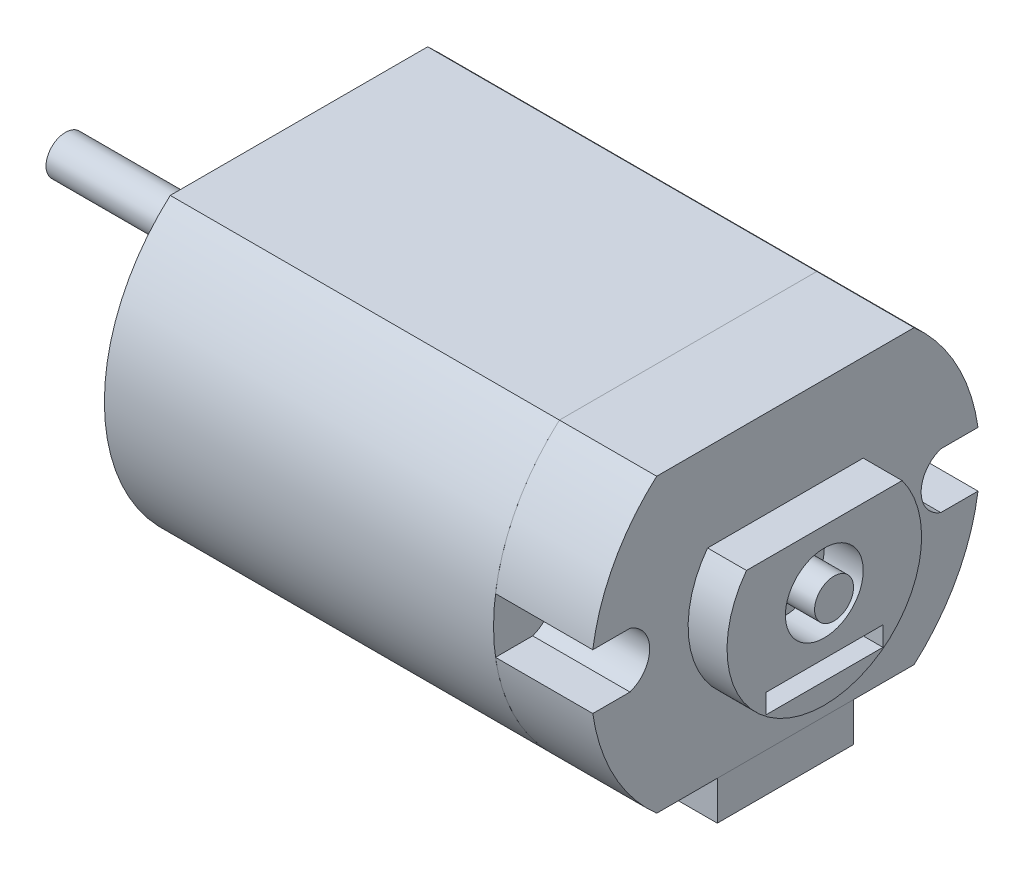
ISO-10303-21;
HEADER;
FILE_DESCRIPTION(('STEP AP214'),'2;1');
FILE_NAME('part.step','',(''),(''),'','','');
FILE_SCHEMA(('AUTOMOTIVE_DESIGN { 1 0 10303 214 1 1 1 1 }'));
ENDSEC;
DATA;
#1=APPLICATION_CONTEXT('core data for automotive mechanical design processes');
#2=APPLICATION_PROTOCOL_DEFINITION('international standard','automotive_design',2000,#1);
#3=PRODUCT_CONTEXT('',#1,'mechanical');
#4=PRODUCT('Part','Part','',(#3));
#5=PRODUCT_RELATED_PRODUCT_CATEGORY('part','',(#4));
#6=PRODUCT_DEFINITION_FORMATION('','',#4);
#7=PRODUCT_DEFINITION_CONTEXT('part definition',#1,'design');
#8=PRODUCT_DEFINITION('design','',#6,#7);
#9=PRODUCT_DEFINITION_SHAPE('','',#8);
#10=(LENGTH_UNIT() NAMED_UNIT(*) SI_UNIT(.MILLI.,.METRE.));
#11=(NAMED_UNIT(*) PLANE_ANGLE_UNIT() SI_UNIT($,.RADIAN.));
#12=(NAMED_UNIT(*) SI_UNIT($,.STERADIAN.) SOLID_ANGLE_UNIT());
#13=UNCERTAINTY_MEASURE_WITH_UNIT(LENGTH_MEASURE(1.E-05),#10,'distance_accuracy_value','');
#14=(GEOMETRIC_REPRESENTATION_CONTEXT(3) GLOBAL_UNCERTAINTY_ASSIGNED_CONTEXT((#13)) GLOBAL_UNIT_ASSIGNED_CONTEXT((#10,
#11,#12)) REPRESENTATION_CONTEXT('',''));
#15=CARTESIAN_POINT('',(0.,0.,0.));
#16=DIRECTION('',(0.,0.,1.));
#17=DIRECTION('',(1.,0.,0.));
#18=AXIS2_PLACEMENT_3D('',#15,#16,#17);
#19=CARTESIAN_POINT('',(-24.5,0.,0.));
#20=DIRECTION('',(1.,0.,0.));
#21=DIRECTION('',(0.,0.,-1.));
#22=AXIS2_PLACEMENT_3D('',#19,#20,#21);
#23=CYLINDRICAL_SURFACE('',#22,1.);
#24=CARTESIAN_POINT('',(-24.5,0.,0.));
#25=DIRECTION('',(-1.,0.,0.));
#26=DIRECTION('',(0.,0.,1.));
#27=AXIS2_PLACEMENT_3D('',#24,#25,#26);
#28=CIRCLE('',#27,1.);
#29=CARTESIAN_POINT('',(-24.5,0.,1.));
#30=VERTEX_POINT('',#29);
#31=EDGE_CURVE('E12',#30,#30,#28,.T.);
#32=ORIENTED_EDGE('',*,*,#31,.F.);
#33=EDGE_LOOP('',(#32));
#34=FACE_BOUND('',#33,.T.);
#35=CARTESIAN_POINT('',(-12.5,0.,0.));
#36=DIRECTION('',(-1.,0.,0.));
#37=DIRECTION('',(0.,0.,1.));
#38=AXIS2_PLACEMENT_3D('',#35,#36,#37);
#39=CIRCLE('',#38,1.);
#40=CARTESIAN_POINT('',(-12.5,0.,1.));
#41=VERTEX_POINT('',#40);
#42=EDGE_CURVE('E94',#41,#41,#39,.T.);
#43=ORIENTED_EDGE('',*,*,#42,.T.);
#44=EDGE_LOOP('',(#43));
#45=FACE_BOUND('',#44,.T.);
#46=ADVANCED_FACE('F87',(#34,#45),#23,.T.);
#47=CARTESIAN_POINT('',(-24.5,0.,0.));
#48=DIRECTION('',(-1.,0.,0.));
#49=DIRECTION('',(0.,0.,1.));
#50=AXIS2_PLACEMENT_3D('',#47,#48,#49);
#51=PLANE('',#50);
#52=ORIENTED_EDGE('',*,*,#31,.T.);
#53=EDGE_LOOP('',(#52));
#54=FACE_BOUND('',#53,.T.);
#55=ADVANCED_FACE('F104',(#54),#51,.T.);
#56=CARTESIAN_POINT('',(-12.5,0.,0.));
#57=DIRECTION('',(-1.,0.,0.));
#58=DIRECTION('',(0.,0.,1.));
#59=AXIS2_PLACEMENT_3D('',#56,#57,#58);
#60=PLANE('',#59);
#61=ORIENTED_EDGE('',*,*,#42,.F.);
#62=EDGE_LOOP('',(#61));
#63=FACE_BOUND('',#62,.T.);
#64=ADVANCED_FACE('F105',(#63),#60,.F.);
#65=CLOSED_SHELL('',(#46,#55,#64));
#66=MANIFOLD_SOLID_BREP('B2',#65);
#67=CARTESIAN_POINT('',(7.5,-9.5,3.5));
#68=DIRECTION('',(0.,-1.,0.));
#69=DIRECTION('',(0.,0.,-1.));
#70=AXIS2_PLACEMENT_3D('',#67,#68,#69);
#71=PLANE('',#70);
#72=DIRECTION('',(0.,0.,-1.));
#73=VECTOR('',#72,1.);
#74=CARTESIAN_POINT('',(12.5,-9.5,3.5));
#75=LINE('',#74,#73);
#76=CARTESIAN_POINT('',(12.5,-9.5,3.5));
#77=VERTEX_POINT('',#76);
#78=CARTESIAN_POINT('',(12.5,-9.5,-3.5));
#79=VERTEX_POINT('',#78);
#80=EDGE_CURVE('E203',#77,#79,#75,.T.);
#81=ORIENTED_EDGE('',*,*,#80,.F.);
#82=DIRECTION('',(1.,0.,0.));
#83=VECTOR('',#82,1.);
#84=CARTESIAN_POINT('',(7.5,-9.5,3.5));
#85=LINE('',#84,#83);
#86=CARTESIAN_POINT('',(7.5,-9.5,3.5));
#87=VERTEX_POINT('',#86);
#88=EDGE_CURVE('E90',#87,#77,#85,.T.);
#89=ORIENTED_EDGE('',*,*,#88,.F.);
#90=DIRECTION('',(0.,0.,-1.));
#91=VECTOR('',#90,1.);
#92=CARTESIAN_POINT('',(7.5,-9.5,3.5));
#93=LINE('',#92,#91);
#94=CARTESIAN_POINT('',(7.5,-9.5,-3.5));
#95=VERTEX_POINT('',#94);
#96=EDGE_CURVE('E199',#87,#95,#93,.T.);
#97=ORIENTED_EDGE('',*,*,#96,.T.);
#98=DIRECTION('',(1.,0.,0.));
#99=VECTOR('',#98,1.);
#100=CARTESIAN_POINT('',(7.5,-9.5,-3.5));
#101=LINE('',#100,#99);
#102=EDGE_CURVE('E141',#95,#79,#101,.T.);
#103=ORIENTED_EDGE('',*,*,#102,.T.);
#104=EDGE_LOOP('',(#81,#89,#97,#103));
#105=FACE_BOUND('',#104,.T.);
#106=ADVANCED_FACE('F138',(#105),#71,.T.);
#107=CARTESIAN_POINT('',(7.5,-9.5,3.5));
#108=DIRECTION('',(0.,0.,-1.));
#109=DIRECTION('',(-1.,0.,0.));
#110=AXIS2_PLACEMENT_3D('',#107,#108,#109);
#111=PLANE('',#110);
#112=DIRECTION('',(0.,1.,0.));
#113=VECTOR('',#112,1.);
#114=CARTESIAN_POINT('',(12.5,-9.5,3.5));
#115=LINE('',#114,#113);
#116=CARTESIAN_POINT('',(12.5,-7.5,3.5));
#117=VERTEX_POINT('',#116);
#118=EDGE_CURVE('E173',#77,#117,#115,.T.);
#119=ORIENTED_EDGE('',*,*,#118,.T.);
#120=DIRECTION('',(1.,0.,0.));
#121=VECTOR('',#120,1.);
#122=CARTESIAN_POINT('',(7.5,-7.5,3.5));
#123=LINE('',#122,#121);
#124=CARTESIAN_POINT('',(7.5,-7.5,3.5));
#125=VERTEX_POINT('',#124);
#126=EDGE_CURVE('E146',#125,#117,#123,.T.);
#127=ORIENTED_EDGE('',*,*,#126,.F.);
#128=DIRECTION('',(0.,1.,0.));
#129=VECTOR('',#128,1.);
#130=CARTESIAN_POINT('',(7.5,-9.5,3.5));
#131=LINE('',#130,#129);
#132=EDGE_CURVE('E188',#87,#125,#131,.T.);
#133=ORIENTED_EDGE('',*,*,#132,.F.);
#134=ORIENTED_EDGE('',*,*,#88,.T.);
#135=EDGE_LOOP('',(#119,#127,#133,#134));
#136=FACE_BOUND('',#135,.T.);
#137=ADVANCED_FACE('F213',(#136),#111,.F.);
#138=CARTESIAN_POINT('',(7.5,-7.5,3.5));
#139=DIRECTION('',(0.,-1.,0.));
#140=DIRECTION('',(0.,0.,-1.));
#141=AXIS2_PLACEMENT_3D('',#138,#139,#140);
#142=PLANE('',#141);
#143=DIRECTION('',(0.,0.,-1.));
#144=VECTOR('',#143,1.);
#145=CARTESIAN_POINT('',(12.5,-7.5,3.5));
#146=LINE('',#145,#144);
#147=CARTESIAN_POINT('',(12.5,-7.5,-3.5));
#148=VERTEX_POINT('',#147);
#149=EDGE_CURVE('E200',#117,#148,#146,.T.);
#150=ORIENTED_EDGE('',*,*,#149,.T.);
#151=DIRECTION('',(1.,0.,0.));
#152=VECTOR('',#151,1.);
#153=CARTESIAN_POINT('',(7.5,-7.5,-3.5));
#154=LINE('',#153,#152);
#155=CARTESIAN_POINT('',(7.5,-7.5,-3.5));
#156=VERTEX_POINT('',#155);
#157=EDGE_CURVE('E191',#156,#148,#154,.T.);
#158=ORIENTED_EDGE('',*,*,#157,.F.);
#159=DIRECTION('',(0.,0.,-1.));
#160=VECTOR('',#159,1.);
#161=CARTESIAN_POINT('',(7.5,-7.5,3.5));
#162=LINE('',#161,#160);
#163=EDGE_CURVE('E184',#125,#156,#162,.T.);
#164=ORIENTED_EDGE('',*,*,#163,.F.);
#165=ORIENTED_EDGE('',*,*,#126,.T.);
#166=EDGE_LOOP('',(#150,#158,#164,#165));
#167=FACE_BOUND('',#166,.T.);
#168=ADVANCED_FACE('F193',(#167),#142,.F.);
#169=CARTESIAN_POINT('',(7.5,-9.5,-3.5));
#170=DIRECTION('',(0.,0.,-1.));
#171=DIRECTION('',(-1.,0.,0.));
#172=AXIS2_PLACEMENT_3D('',#169,#170,#171);
#173=PLANE('',#172);
#174=DIRECTION('',(0.,1.,0.));
#175=VECTOR('',#174,1.);
#176=CARTESIAN_POINT('',(12.5,-9.5,-3.5));
#177=LINE('',#176,#175);
#178=EDGE_CURVE('E206',#79,#148,#177,.T.);
#179=ORIENTED_EDGE('',*,*,#178,.F.);
#180=ORIENTED_EDGE('',*,*,#102,.F.);
#181=DIRECTION('',(0.,1.,0.));
#182=VECTOR('',#181,1.);
#183=CARTESIAN_POINT('',(7.5,-9.5,-3.5));
#184=LINE('',#183,#182);
#185=EDGE_CURVE('E186',#95,#156,#184,.T.);
#186=ORIENTED_EDGE('',*,*,#185,.T.);
#187=ORIENTED_EDGE('',*,*,#157,.T.);
#188=EDGE_LOOP('',(#179,#180,#186,#187));
#189=FACE_BOUND('',#188,.T.);
#190=ADVANCED_FACE('F197',(#189),#173,.T.);
#191=CARTESIAN_POINT('',(7.5,0.,0.));
#192=DIRECTION('',(1.,0.,0.));
#193=DIRECTION('',(0.,0.,-1.));
#194=AXIS2_PLACEMENT_3D('',#191,#192,#193);
#195=PLANE('',#194);
#196=ORIENTED_EDGE('',*,*,#96,.F.);
#197=ORIENTED_EDGE('',*,*,#132,.T.);
#198=ORIENTED_EDGE('',*,*,#163,.T.);
#199=ORIENTED_EDGE('',*,*,#185,.F.);
#200=EDGE_LOOP('',(#196,#197,#198,#199));
#201=FACE_BOUND('',#200,.T.);
#202=ADVANCED_FACE('F189',(#201),#195,.F.);
#203=CARTESIAN_POINT('',(12.5,0.,0.));
#204=DIRECTION('',(1.,0.,0.));
#205=DIRECTION('',(0.,0.,-1.));
#206=AXIS2_PLACEMENT_3D('',#203,#204,#205);
#207=PLANE('',#206);
#208=ORIENTED_EDGE('',*,*,#80,.T.);
#209=ORIENTED_EDGE('',*,*,#178,.T.);
#210=ORIENTED_EDGE('',*,*,#149,.F.);
#211=ORIENTED_EDGE('',*,*,#118,.F.);
#212=EDGE_LOOP('',(#208,#209,#210,#211));
#213=FACE_BOUND('',#212,.T.);
#214=ADVANCED_FACE('F214',(#213),#207,.T.);
#215=CLOSED_SHELL('',(#106,#137,#168,#190,#202,#214));
#216=MANIFOLD_SOLID_BREP('B7',#215);
#217=CARTESIAN_POINT('',(14.5,0.,0.));
#218=DIRECTION('',(1.,0.,0.));
#219=DIRECTION('',(0.,0.,-1.));
#220=AXIS2_PLACEMENT_3D('',#217,#218,#219);
#221=PLANE('',#220);
#222=CARTESIAN_POINT('',(14.5,0.,0.));
#223=DIRECTION('',(1.,0.,0.));
#224=DIRECTION('',(0.,0.,-1.));
#225=AXIS2_PLACEMENT_3D('',#222,#223,#224);
#226=CIRCLE('',#225,5.);
#227=CARTESIAN_POINT('',(14.5,3.,4.));
#228=VERTEX_POINT('',#227);
#229=CARTESIAN_POINT('',(14.5,3.,-4.));
#230=VERTEX_POINT('',#229);
#231=EDGE_CURVE('E395',#228,#230,#226,.T.);
#232=ORIENTED_EDGE('',*,*,#231,.T.);
#233=DIRECTION('',(0.,0.,-1.));
#234=VECTOR('',#233,1.);
#235=CARTESIAN_POINT('',(14.5,3.,4.));
#236=LINE('',#235,#234);
#237=EDGE_CURVE('E392',#228,#230,#236,.T.);
#238=ORIENTED_EDGE('',*,*,#237,.F.);
#239=EDGE_LOOP('',(#232,#238));
#240=FACE_BOUND('',#239,.T.);
#241=DIRECTION('',(0.,1.,0.));
#242=VECTOR('',#241,1.);
#243=CARTESIAN_POINT('',(14.5,-3.92704293241706,2.98784204377299));
#244=LINE('',#243,#242);
#245=CARTESIAN_POINT('',(14.5,-3.92704293241706,2.98784204377299));
#246=VERTEX_POINT('',#245);
#247=CARTESIAN_POINT('',(14.5,-2.92704293241706,2.98784204377299));
#248=VERTEX_POINT('',#247);
#249=EDGE_CURVE('E358',#246,#248,#244,.T.);
#250=ORIENTED_EDGE('',*,*,#249,.T.);
#251=DIRECTION('',(0.,0.,-1.));
#252=VECTOR('',#251,1.);
#253=CARTESIAN_POINT('',(14.5,-2.92704293241706,2.98784204377299));
#254=LINE('',#253,#252);
#255=CARTESIAN_POINT('',(14.5,-2.92704293241706,-3.01215795622701));
#256=VERTEX_POINT('',#255);
#257=EDGE_CURVE('E365',#248,#256,#254,.T.);
#258=ORIENTED_EDGE('',*,*,#257,.T.);
#259=DIRECTION('',(0.,1.,0.));
#260=VECTOR('',#259,1.);
#261=CARTESIAN_POINT('',(14.5,-3.92704293241706,-3.01215795622701));
#262=LINE('',#261,#260);
#263=CARTESIAN_POINT('',(14.5,-3.92704293241706,-3.01215795622701));
#264=VERTEX_POINT('',#263);
#265=EDGE_CURVE('E366',#264,#256,#262,.T.);
#266=ORIENTED_EDGE('',*,*,#265,.F.);
#267=DIRECTION('',(0.,0.,-1.));
#268=VECTOR('',#267,1.);
#269=CARTESIAN_POINT('',(14.5,-3.92704293241706,2.98784204377299));
#270=LINE('',#269,#268);
#271=EDGE_CURVE('E360',#246,#264,#270,.T.);
#272=ORIENTED_EDGE('',*,*,#271,.F.);
#273=EDGE_LOOP('',(#250,#258,#266,#272));
#274=FACE_BOUND('',#273,.T.);
#275=CARTESIAN_POINT('',(14.5,0.,0.));
#276=DIRECTION('',(1.,0.,0.));
#277=DIRECTION('',(0.,0.,-1.));
#278=AXIS2_PLACEMENT_3D('',#275,#276,#277);
#279=CIRCLE('',#278,2.);
#280=CARTESIAN_POINT('',(14.5,0.,-2.));
#281=VERTEX_POINT('',#280);
#282=EDGE_CURVE('E385',#281,#281,#279,.T.);
#283=ORIENTED_EDGE('',*,*,#282,.F.);
#284=EDGE_LOOP('',(#283));
#285=FACE_BOUND('',#284,.T.);
#286=ADVANCED_FACE('F305',(#240,#274,#285),#221,.T.);
#287=CARTESIAN_POINT('',(12.5,0.,0.));
#288=DIRECTION('',(1.,0.,0.));
#289=DIRECTION('',(0.,0.,-1.));
#290=AXIS2_PLACEMENT_3D('',#287,#288,#289);
#291=PLANE('',#290);
#292=DIRECTION('',(0.,0.,-1.));
#293=VECTOR('',#292,1.);
#294=CARTESIAN_POINT('',(12.5,-2.92704293241706,2.98784204377299));
#295=LINE('',#294,#293);
#296=CARTESIAN_POINT('',(12.5,-2.92704293241706,2.98784204377299));
#297=VERTEX_POINT('',#296);
#298=CARTESIAN_POINT('',(12.5,-2.92704293241706,-3.01215795622701));
#299=VERTEX_POINT('',#298);
#300=EDGE_CURVE('E382',#297,#299,#295,.T.);
#301=ORIENTED_EDGE('',*,*,#300,.F.);
#302=DIRECTION('',(0.,1.,0.));
#303=VECTOR('',#302,1.);
#304=CARTESIAN_POINT('',(12.5,-3.92704293241706,2.98784204377299));
#305=LINE('',#304,#303);
#306=CARTESIAN_POINT('',(12.5,-3.92704293241706,2.98784204377299));
#307=VERTEX_POINT('',#306);
#308=EDGE_CURVE('E323',#307,#297,#305,.T.);
#309=ORIENTED_EDGE('',*,*,#308,.F.);
#310=DIRECTION('',(0.,0.,-1.));
#311=VECTOR('',#310,1.);
#312=CARTESIAN_POINT('',(12.5,-3.92704293241706,2.98784204377299));
#313=LINE('',#312,#311);
#314=CARTESIAN_POINT('',(12.5,-3.92704293241706,-3.01215795622701));
#315=VERTEX_POINT('',#314);
#316=EDGE_CURVE('E367',#307,#315,#313,.T.);
#317=ORIENTED_EDGE('',*,*,#316,.T.);
#318=DIRECTION('',(0.,1.,0.));
#319=VECTOR('',#318,1.);
#320=CARTESIAN_POINT('',(12.5,-3.92704293241706,-3.01215795622701));
#321=LINE('',#320,#319);
#322=EDGE_CURVE('E375',#315,#299,#321,.T.);
#323=ORIENTED_EDGE('',*,*,#322,.T.);
#324=EDGE_LOOP('',(#301,#309,#317,#323));
#325=FACE_BOUND('',#324,.T.);
#326=CARTESIAN_POINT('',(12.5,0.,0.));
#327=DIRECTION('',(1.,0.,0.));
#328=DIRECTION('',(0.,0.,-1.));
#329=AXIS2_PLACEMENT_3D('',#326,#327,#328);
#330=CIRCLE('',#329,5.);
#331=CARTESIAN_POINT('',(12.5,3.,4.));
#332=VERTEX_POINT('',#331);
#333=CARTESIAN_POINT('',(12.5,3.,-4.));
#334=VERTEX_POINT('',#333);
#335=EDGE_CURVE('E389',#332,#334,#330,.T.);
#336=ORIENTED_EDGE('',*,*,#335,.F.);
#337=DIRECTION('',(0.,0.,-1.));
#338=VECTOR('',#337,1.);
#339=CARTESIAN_POINT('',(12.5,3.,4.));
#340=LINE('',#339,#338);
#341=EDGE_CURVE('E394',#332,#334,#340,.T.);
#342=ORIENTED_EDGE('',*,*,#341,.T.);
#343=EDGE_LOOP('',(#336,#342));
#344=FACE_BOUND('',#343,.T.);
#345=CARTESIAN_POINT('',(12.5,0.,0.));
#346=DIRECTION('',(1.,0.,0.));
#347=DIRECTION('',(0.,0.,-1.));
#348=AXIS2_PLACEMENT_3D('',#345,#346,#347);
#349=CIRCLE('',#348,2.);
#350=CARTESIAN_POINT('',(12.5,0.,-2.));
#351=VERTEX_POINT('',#350);
#352=EDGE_CURVE('E374',#351,#351,#349,.T.);
#353=ORIENTED_EDGE('',*,*,#352,.T.);
#354=EDGE_LOOP('',(#353));
#355=FACE_BOUND('',#354,.T.);
#356=ADVANCED_FACE('F406',(#325,#344,#355),#291,.F.);
#357=CARTESIAN_POINT('',(14.5,0.,0.));
#358=DIRECTION('',(-1.,0.,0.));
#359=DIRECTION('',(0.,0.,1.));
#360=AXIS2_PLACEMENT_3D('',#357,#358,#359);
#361=CYLINDRICAL_SURFACE('',#360,5.);
#362=ORIENTED_EDGE('',*,*,#335,.T.);
#363=DIRECTION('',(-1.,0.,0.));
#364=VECTOR('',#363,1.);
#365=CARTESIAN_POINT('',(14.5,3.,-4.));
#366=LINE('',#365,#364);
#367=EDGE_CURVE('E140',#230,#334,#366,.T.);
#368=ORIENTED_EDGE('',*,*,#367,.F.);
#369=ORIENTED_EDGE('',*,*,#231,.F.);
#370=DIRECTION('',(-1.,0.,0.));
#371=VECTOR('',#370,1.);
#372=CARTESIAN_POINT('',(14.5,3.,4.));
#373=LINE('',#372,#371);
#374=EDGE_CURVE('E309',#228,#332,#373,.T.);
#375=ORIENTED_EDGE('',*,*,#374,.T.);
#376=EDGE_LOOP('',(#362,#368,#369,#375));
#377=FACE_BOUND('',#376,.T.);
#378=ADVANCED_FACE('F302',(#377),#361,.T.);
#379=CARTESIAN_POINT('',(14.5,3.,4.));
#380=DIRECTION('',(0.,1.,0.));
#381=DIRECTION('',(0.,0.,1.));
#382=AXIS2_PLACEMENT_3D('',#379,#380,#381);
#383=PLANE('',#382);
#384=ORIENTED_EDGE('',*,*,#341,.F.);
#385=ORIENTED_EDGE('',*,*,#374,.F.);
#386=ORIENTED_EDGE('',*,*,#237,.T.);
#387=ORIENTED_EDGE('',*,*,#367,.T.);
#388=EDGE_LOOP('',(#384,#385,#386,#387));
#389=FACE_BOUND('',#388,.T.);
#390=ADVANCED_FACE('F413',(#389),#383,.T.);
#391=CARTESIAN_POINT('',(14.5,-3.92704293241706,2.98784204377299));
#392=DIRECTION('',(0.,0.,1.));
#393=DIRECTION('',(1.,0.,0.));
#394=AXIS2_PLACEMENT_3D('',#391,#392,#393);
#395=PLANE('',#394);
#396=ORIENTED_EDGE('',*,*,#308,.T.);
#397=DIRECTION('',(-1.,0.,0.));
#398=VECTOR('',#397,1.);
#399=CARTESIAN_POINT('',(14.5,-2.92704293241706,2.98784204377299));
#400=LINE('',#399,#398);
#401=EDGE_CURVE('E355',#248,#297,#400,.T.);
#402=ORIENTED_EDGE('',*,*,#401,.F.);
#403=ORIENTED_EDGE('',*,*,#249,.F.);
#404=DIRECTION('',(-1.,0.,0.));
#405=VECTOR('',#404,1.);
#406=CARTESIAN_POINT('',(14.5,-3.92704293241706,2.98784204377299));
#407=LINE('',#406,#405);
#408=EDGE_CURVE('E387',#246,#307,#407,.T.);
#409=ORIENTED_EDGE('',*,*,#408,.T.);
#410=EDGE_LOOP('',(#396,#402,#403,#409));
#411=FACE_BOUND('',#410,.T.);
#412=ADVANCED_FACE('F351',(#411),#395,.F.);
#413=CARTESIAN_POINT('',(14.5,-3.92704293241706,2.98784204377299));
#414=DIRECTION('',(0.,1.,0.));
#415=DIRECTION('',(0.,0.,1.));
#416=AXIS2_PLACEMENT_3D('',#413,#414,#415);
#417=PLANE('',#416);
#418=ORIENTED_EDGE('',*,*,#316,.F.);
#419=ORIENTED_EDGE('',*,*,#408,.F.);
#420=ORIENTED_EDGE('',*,*,#271,.T.);
#421=DIRECTION('',(-1.,0.,0.));
#422=VECTOR('',#421,1.);
#423=CARTESIAN_POINT('',(14.5,-3.92704293241706,-3.01215795622701));
#424=LINE('',#423,#422);
#425=EDGE_CURVE('E386',#264,#315,#424,.T.);
#426=ORIENTED_EDGE('',*,*,#425,.T.);
#427=EDGE_LOOP('',(#418,#419,#420,#426));
#428=FACE_BOUND('',#427,.T.);
#429=ADVANCED_FACE('F430',(#428),#417,.T.);
#430=CARTESIAN_POINT('',(14.5,-3.92704293241706,-3.01215795622701));
#431=DIRECTION('',(0.,0.,1.));
#432=DIRECTION('',(1.,0.,0.));
#433=AXIS2_PLACEMENT_3D('',#430,#431,#432);
#434=PLANE('',#433);
#435=ORIENTED_EDGE('',*,*,#322,.F.);
#436=ORIENTED_EDGE('',*,*,#425,.F.);
#437=ORIENTED_EDGE('',*,*,#265,.T.);
#438=DIRECTION('',(-1.,0.,0.));
#439=VECTOR('',#438,1.);
#440=CARTESIAN_POINT('',(14.5,-2.92704293241706,-3.01215795622701));
#441=LINE('',#440,#439);
#442=EDGE_CURVE('E320',#256,#299,#441,.T.);
#443=ORIENTED_EDGE('',*,*,#442,.T.);
#444=EDGE_LOOP('',(#435,#436,#437,#443));
#445=FACE_BOUND('',#444,.T.);
#446=ADVANCED_FACE('F451',(#445),#434,.T.);
#447=CARTESIAN_POINT('',(14.5,-2.92704293241706,2.98784204377299));
#448=DIRECTION('',(0.,1.,0.));
#449=DIRECTION('',(0.,0.,1.));
#450=AXIS2_PLACEMENT_3D('',#447,#448,#449);
#451=PLANE('',#450);
#452=ORIENTED_EDGE('',*,*,#300,.T.);
#453=ORIENTED_EDGE('',*,*,#442,.F.);
#454=ORIENTED_EDGE('',*,*,#257,.F.);
#455=ORIENTED_EDGE('',*,*,#401,.T.);
#456=EDGE_LOOP('',(#452,#453,#454,#455));
#457=FACE_BOUND('',#456,.T.);
#458=ADVANCED_FACE('F361',(#457),#451,.F.);
#459=CARTESIAN_POINT('',(14.5,0.,0.));
#460=DIRECTION('',(-1.,0.,0.));
#461=DIRECTION('',(0.,0.,1.));
#462=AXIS2_PLACEMENT_3D('',#459,#460,#461);
#463=CYLINDRICAL_SURFACE('',#462,2.);
#464=ORIENTED_EDGE('',*,*,#282,.T.);
#465=EDGE_LOOP('',(#464));
#466=FACE_BOUND('',#465,.T.);
#467=ORIENTED_EDGE('',*,*,#352,.F.);
#468=EDGE_LOOP('',(#467));
#469=FACE_BOUND('',#468,.T.);
#470=ADVANCED_FACE('F472',(#466,#469),#463,.F.);
#471=CLOSED_SHELL('',(#286,#356,#378,#390,#412,#429,#446,#458,#470));
#472=MANIFOLD_SOLID_BREP('B82',#471);
#473=CARTESIAN_POINT('',(15.,0.,0.));
#474=DIRECTION('',(-1.,0.,0.));
#475=DIRECTION('',(0.,0.,1.));
#476=AXIS2_PLACEMENT_3D('',#473,#474,#475);
#477=CYLINDRICAL_SURFACE('',#476,1.);
#478=CARTESIAN_POINT('',(15.,0.,0.));
#479=DIRECTION('',(1.,0.,0.));
#480=DIRECTION('',(0.,0.,-1.));
#481=AXIS2_PLACEMENT_3D('',#478,#479,#480);
#482=CIRCLE('',#481,1.);
#483=CARTESIAN_POINT('',(15.,0.,-1.));
#484=VERTEX_POINT('',#483);
#485=EDGE_CURVE('E301',#484,#484,#482,.T.);
#486=ORIENTED_EDGE('',*,*,#485,.F.);
#487=EDGE_LOOP('',(#486));
#488=FACE_BOUND('',#487,.T.);
#489=CARTESIAN_POINT('',(12.5,0.,0.));
#490=DIRECTION('',(1.,0.,0.));
#491=DIRECTION('',(0.,0.,-1.));
#492=AXIS2_PLACEMENT_3D('',#489,#490,#491);
#493=CIRCLE('',#492,1.);
#494=CARTESIAN_POINT('',(12.5,0.,-1.));
#495=VERTEX_POINT('',#494);
#496=EDGE_CURVE('E565',#495,#495,#493,.T.);
#497=ORIENTED_EDGE('',*,*,#496,.T.);
#498=EDGE_LOOP('',(#497));
#499=FACE_BOUND('',#498,.T.);
#500=ADVANCED_FACE('F559',(#488,#499),#477,.T.);
#501=CARTESIAN_POINT('',(15.,0.,0.));
#502=DIRECTION('',(1.,0.,0.));
#503=DIRECTION('',(0.,0.,-1.));
#504=AXIS2_PLACEMENT_3D('',#501,#502,#503);
#505=PLANE('',#504);
#506=ORIENTED_EDGE('',*,*,#485,.T.);
#507=EDGE_LOOP('',(#506));
#508=FACE_BOUND('',#507,.T.);
#509=ADVANCED_FACE('F573',(#508),#505,.T.);
#510=CARTESIAN_POINT('',(12.5,0.,0.));
#511=DIRECTION('',(1.,0.,0.));
#512=DIRECTION('',(0.,0.,-1.));
#513=AXIS2_PLACEMENT_3D('',#510,#511,#512);
#514=PLANE('',#513);
#515=ORIENTED_EDGE('',*,*,#496,.F.);
#516=EDGE_LOOP('',(#515));
#517=FACE_BOUND('',#516,.T.);
#518=ADVANCED_FACE('F575',(#517),#514,.F.);
#519=CLOSED_SHELL('',(#500,#509,#518));
#520=MANIFOLD_SOLID_BREP('B135',#519);
#521=CARTESIAN_POINT('',(12.5,0.,0.));
#522=DIRECTION('',(-1.,0.,0.));
#523=DIRECTION('',(0.,0.,1.));
#524=AXIS2_PLACEMENT_3D('',#521,#522,#523);
#525=CYLINDRICAL_SURFACE('',#524,10.);
#526=CARTESIAN_POINT('',(7.5,0.,0.));
#527=DIRECTION('',(1.,0.,0.));
#528=DIRECTION('',(0.,0.,1.));
#529=AXIS2_PLACEMENT_3D('',#526,#527,#528);
#530=CIRCLE('',#529,10.);
#531=CARTESIAN_POINT('',(7.5,7.5,6.61437827766148));
#532=VERTEX_POINT('',#531);
#533=CARTESIAN_POINT('',(7.5,1.41819936683298,9.89892471715562));
#534=VERTEX_POINT('',#533);
#535=EDGE_CURVE('E729',#532,#534,#530,.T.);
#536=ORIENTED_EDGE('',*,*,#535,.T.);
#537=DIRECTION('',(-1.,0.,0.));
#538=VECTOR('',#537,1.);
#539=CARTESIAN_POINT('',(12.5,1.41819936683298,9.89892471715562));
#540=LINE('',#539,#538);
#541=CARTESIAN_POINT('',(12.5,1.41819936683298,9.89892471715562));
#542=VERTEX_POINT('',#541);
#543=EDGE_CURVE('E560',#542,#534,#540,.T.);
#544=ORIENTED_EDGE('',*,*,#543,.F.);
#545=CARTESIAN_POINT('',(12.5,0.,0.));
#546=DIRECTION('',(1.,0.,0.));
#547=DIRECTION('',(0.,0.,1.));
#548=AXIS2_PLACEMENT_3D('',#545,#546,#547);
#549=CIRCLE('',#548,10.);
#550=CARTESIAN_POINT('',(12.5,7.5,6.61437827766148));
#551=VERTEX_POINT('',#550);
#552=EDGE_CURVE('E753',#551,#542,#549,.T.);
#553=ORIENTED_EDGE('',*,*,#552,.F.);
#554=DIRECTION('',(-1.,0.,0.));
#555=VECTOR('',#554,1.);
#556=CARTESIAN_POINT('',(12.5,7.5,6.61437827766148));
#557=LINE('',#556,#555);
#558=EDGE_CURVE('E723',#551,#532,#557,.T.);
#559=ORIENTED_EDGE('',*,*,#558,.T.);
#560=EDGE_LOOP('',(#536,#544,#553,#559));
#561=FACE_BOUND('',#560,.T.);
#562=ADVANCED_FACE('F607',(#561),#525,.T.);
#563=CARTESIAN_POINT('',(12.5,1.41819936683298,7.98699974193661));
#564=DIRECTION('',(0.,1.,0.));
#565=DIRECTION('',(0.,0.,1.));
#566=AXIS2_PLACEMENT_3D('',#563,#564,#565);
#567=PLANE('',#566);
#568=DIRECTION('',(0.,0.,-1.));
#569=VECTOR('',#568,1.);
#570=CARTESIAN_POINT('',(7.5,1.41819936683298,7.98699974193661));
#571=LINE('',#570,#569);
#572=CARTESIAN_POINT('',(7.5,1.41819936683298,7.98699974193661));
#573=VERTEX_POINT('',#572);
#574=EDGE_CURVE('E735',#534,#573,#571,.T.);
#575=ORIENTED_EDGE('',*,*,#574,.T.);
#576=DIRECTION('',(-1.,0.,0.));
#577=VECTOR('',#576,1.);
#578=CARTESIAN_POINT('',(12.5,1.41819936683298,7.98699974193661));
#579=LINE('',#578,#577);
#580=CARTESIAN_POINT('',(12.5,1.41819936683298,7.98699974193661));
#581=VERTEX_POINT('',#580);
#582=EDGE_CURVE('E617',#581,#573,#579,.T.);
#583=ORIENTED_EDGE('',*,*,#582,.F.);
#584=DIRECTION('',(0.,0.,-1.));
#585=VECTOR('',#584,1.);
#586=CARTESIAN_POINT('',(12.5,1.41819936683298,7.98699974193661));
#587=LINE('',#586,#585);
#588=EDGE_CURVE('E678',#542,#581,#587,.T.);
#589=ORIENTED_EDGE('',*,*,#588,.F.);
#590=ORIENTED_EDGE('',*,*,#543,.T.);
#591=EDGE_LOOP('',(#575,#583,#589,#590));
#592=FACE_BOUND('',#591,.T.);
#593=ADVANCED_FACE('F827',(#592),#567,.F.);
#594=CARTESIAN_POINT('',(12.5,0.,8.47557988471212));
#595=DIRECTION('',(-1.,0.,0.));
#596=DIRECTION('',(0.,0.,1.));
#597=AXIS2_PLACEMENT_3D('',#594,#595,#596);
#598=CYLINDRICAL_SURFACE('',#597,1.5);
#599=CARTESIAN_POINT('',(7.5,0.,8.47557988471212));
#600=DIRECTION('',(-1.,0.,0.));
#601=DIRECTION('',(0.,0.,-1.));
#602=AXIS2_PLACEMENT_3D('',#599,#600,#601);
#603=CIRCLE('',#602,1.5);
#604=CARTESIAN_POINT('',(7.5,-1.41819936683298,7.98699974193661));
#605=VERTEX_POINT('',#604);
#606=EDGE_CURVE('E731',#573,#605,#603,.T.);
#607=ORIENTED_EDGE('',*,*,#606,.T.);
#608=DIRECTION('',(-1.,0.,0.));
#609=VECTOR('',#608,1.);
#610=CARTESIAN_POINT('',(12.5,-1.41819936683298,7.98699974193661));
#611=LINE('',#610,#609);
#612=CARTESIAN_POINT('',(12.5,-1.41819936683298,7.98699974193661));
#613=VERTEX_POINT('',#612);
#614=EDGE_CURVE('E769',#613,#605,#611,.T.);
#615=ORIENTED_EDGE('',*,*,#614,.F.);
#616=CARTESIAN_POINT('',(12.5,0.,8.47557988471212));
#617=DIRECTION('',(-1.,0.,0.));
#618=DIRECTION('',(0.,0.,-1.));
#619=AXIS2_PLACEMENT_3D('',#616,#617,#618);
#620=CIRCLE('',#619,1.5);
#621=EDGE_CURVE('E779',#581,#613,#620,.T.);
#622=ORIENTED_EDGE('',*,*,#621,.F.);
#623=ORIENTED_EDGE('',*,*,#582,.T.);
#624=EDGE_LOOP('',(#607,#615,#622,#623));
#625=FACE_BOUND('',#624,.T.);
#626=ADVANCED_FACE('F777',(#625),#598,.F.);
#627=CARTESIAN_POINT('',(12.5,-1.41819936683298,7.98699974193661));
#628=DIRECTION('',(0.,-1.,0.));
#629=DIRECTION('',(0.,0.,-1.));
#630=AXIS2_PLACEMENT_3D('',#627,#628,#629);
#631=PLANE('',#630);
#632=DIRECTION('',(0.,0.,1.));
#633=VECTOR('',#632,1.);
#634=CARTESIAN_POINT('',(7.5,-1.41819936683298,7.98699974193661));
#635=LINE('',#634,#633);
#636=CARTESIAN_POINT('',(7.5,-1.41819936683298,9.89892471715562));
#637=VERTEX_POINT('',#636);
#638=EDGE_CURVE('E738',#605,#637,#635,.T.);
#639=ORIENTED_EDGE('',*,*,#638,.T.);
#640=DIRECTION('',(-1.,0.,0.));
#641=VECTOR('',#640,1.);
#642=CARTESIAN_POINT('',(12.5,-1.41819936683298,9.89892471715562));
#643=LINE('',#642,#641);
#644=CARTESIAN_POINT('',(12.5,-1.41819936683298,9.89892471715562));
#645=VERTEX_POINT('',#644);
#646=EDGE_CURVE('E770',#645,#637,#643,.T.);
#647=ORIENTED_EDGE('',*,*,#646,.F.);
#648=DIRECTION('',(0.,0.,1.));
#649=VECTOR('',#648,1.);
#650=CARTESIAN_POINT('',(12.5,-1.41819936683298,7.98699974193661));
#651=LINE('',#650,#649);
#652=EDGE_CURVE('E797',#613,#645,#651,.T.);
#653=ORIENTED_EDGE('',*,*,#652,.F.);
#654=ORIENTED_EDGE('',*,*,#614,.T.);
#655=EDGE_LOOP('',(#639,#647,#653,#654));
#656=FACE_BOUND('',#655,.T.);
#657=ADVANCED_FACE('F789',(#656),#631,.F.);
#658=CARTESIAN_POINT('',(12.5,0.,0.));
#659=DIRECTION('',(-1.,0.,0.));
#660=DIRECTION('',(0.,0.,1.));
#661=AXIS2_PLACEMENT_3D('',#658,#659,#660);
#662=CYLINDRICAL_SURFACE('',#661,10.);
#663=CARTESIAN_POINT('',(7.5,0.,0.));
#664=DIRECTION('',(1.,0.,0.));
#665=DIRECTION('',(0.,0.,1.));
#666=AXIS2_PLACEMENT_3D('',#663,#664,#665);
#667=CIRCLE('',#666,10.);
#668=CARTESIAN_POINT('',(7.5,-7.5,6.61437827766148));
#669=VERTEX_POINT('',#668);
#670=EDGE_CURVE('E736',#637,#669,#667,.T.);
#671=ORIENTED_EDGE('',*,*,#670,.T.);
#672=DIRECTION('',(-1.,0.,0.));
#673=VECTOR('',#672,1.);
#674=CARTESIAN_POINT('',(12.5,-7.5,6.61437827766148));
#675=LINE('',#674,#673);
#676=CARTESIAN_POINT('',(12.5,-7.5,6.61437827766148));
#677=VERTEX_POINT('',#676);
#678=EDGE_CURVE('E762',#677,#669,#675,.T.);
#679=ORIENTED_EDGE('',*,*,#678,.F.);
#680=CARTESIAN_POINT('',(12.5,0.,0.));
#681=DIRECTION('',(1.,0.,0.));
#682=DIRECTION('',(0.,0.,1.));
#683=AXIS2_PLACEMENT_3D('',#680,#681,#682);
#684=CIRCLE('',#683,10.);
#685=EDGE_CURVE('E791',#645,#677,#684,.T.);
#686=ORIENTED_EDGE('',*,*,#685,.F.);
#687=ORIENTED_EDGE('',*,*,#646,.T.);
#688=EDGE_LOOP('',(#671,#679,#686,#687));
#689=FACE_BOUND('',#688,.T.);
#690=ADVANCED_FACE('F792',(#689),#662,.T.);
#691=CARTESIAN_POINT('',(12.5,-7.5,-6.61437827766148));
#692=DIRECTION('',(0.,1.,0.));
#693=DIRECTION('',(0.,0.,1.));
#694=AXIS2_PLACEMENT_3D('',#691,#692,#693);
#695=PLANE('',#694);
#696=DIRECTION('',(0.,0.,-1.));
#697=VECTOR('',#696,1.);
#698=CARTESIAN_POINT('',(7.5,-7.5,-6.61437827766148));
#699=LINE('',#698,#697);
#700=CARTESIAN_POINT('',(7.5,-7.5,-6.61437827766148));
#701=VERTEX_POINT('',#700);
#702=EDGE_CURVE('E739',#669,#701,#699,.T.);
#703=ORIENTED_EDGE('',*,*,#702,.T.);
#704=DIRECTION('',(-1.,0.,0.));
#705=VECTOR('',#704,1.);
#706=CARTESIAN_POINT('',(12.5,-7.5,-6.61437827766148));
#707=LINE('',#706,#705);
#708=CARTESIAN_POINT('',(12.5,-7.5,-6.61437827766148));
#709=VERTEX_POINT('',#708);
#710=EDGE_CURVE('E761',#709,#701,#707,.T.);
#711=ORIENTED_EDGE('',*,*,#710,.F.);
#712=DIRECTION('',(0.,0.,-1.));
#713=VECTOR('',#712,1.);
#714=CARTESIAN_POINT('',(12.5,-7.5,-6.61437827766148));
#715=LINE('',#714,#713);
#716=EDGE_CURVE('E793',#677,#709,#715,.T.);
#717=ORIENTED_EDGE('',*,*,#716,.F.);
#718=ORIENTED_EDGE('',*,*,#678,.T.);
#719=EDGE_LOOP('',(#703,#711,#717,#718));
#720=FACE_BOUND('',#719,.T.);
#721=ADVANCED_FACE('F845',(#720),#695,.F.);
#722=CARTESIAN_POINT('',(12.5,0.,0.));
#723=DIRECTION('',(-1.,0.,0.));
#724=DIRECTION('',(0.,0.,1.));
#725=AXIS2_PLACEMENT_3D('',#722,#723,#724);
#726=CYLINDRICAL_SURFACE('',#725,10.);
#727=CARTESIAN_POINT('',(7.5,0.,0.));
#728=DIRECTION('',(1.,0.,0.));
#729=DIRECTION('',(0.,0.,1.));
#730=AXIS2_PLACEMENT_3D('',#727,#728,#729);
#731=CIRCLE('',#730,10.);
#732=CARTESIAN_POINT('',(7.5,-1.41819936683298,-9.89892471715562));
#733=VERTEX_POINT('',#732);
#734=EDGE_CURVE('E744',#701,#733,#731,.T.);
#735=ORIENTED_EDGE('',*,*,#734,.T.);
#736=DIRECTION('',(-1.,0.,0.));
#737=VECTOR('',#736,1.);
#738=CARTESIAN_POINT('',(12.5,-1.41819936683298,-9.89892471715562));
#739=LINE('',#738,#737);
#740=CARTESIAN_POINT('',(12.5,-1.41819936683298,-9.89892471715562));
#741=VERTEX_POINT('',#740);
#742=EDGE_CURVE('E758',#741,#733,#739,.T.);
#743=ORIENTED_EDGE('',*,*,#742,.F.);
#744=CARTESIAN_POINT('',(12.5,0.,0.));
#745=DIRECTION('',(1.,0.,0.));
#746=DIRECTION('',(0.,0.,1.));
#747=AXIS2_PLACEMENT_3D('',#744,#745,#746);
#748=CIRCLE('',#747,10.);
#749=EDGE_CURVE('E799',#709,#741,#748,.T.);
#750=ORIENTED_EDGE('',*,*,#749,.F.);
#751=ORIENTED_EDGE('',*,*,#710,.T.);
#752=EDGE_LOOP('',(#735,#743,#750,#751));
#753=FACE_BOUND('',#752,.T.);
#754=ADVANCED_FACE('F843',(#753),#726,.T.);
#755=CARTESIAN_POINT('',(12.5,-1.41819936683298,-7.98699974193661));
#756=DIRECTION('',(0.,-1.,0.));
#757=DIRECTION('',(0.,0.,-1.));
#758=AXIS2_PLACEMENT_3D('',#755,#756,#757);
#759=PLANE('',#758);
#760=DIRECTION('',(0.,0.,1.));
#761=VECTOR('',#760,1.);
#762=CARTESIAN_POINT('',(7.5,-1.41819936683298,-7.98699974193661));
#763=LINE('',#762,#761);
#764=CARTESIAN_POINT('',(7.5,-1.41819936683298,-7.98699974193661));
#765=VERTEX_POINT('',#764);
#766=EDGE_CURVE('E741',#733,#765,#763,.T.);
#767=ORIENTED_EDGE('',*,*,#766,.T.);
#768=DIRECTION('',(-1.,0.,0.));
#769=VECTOR('',#768,1.);
#770=CARTESIAN_POINT('',(12.5,-1.41819936683298,-7.98699974193661));
#771=LINE('',#770,#769);
#772=CARTESIAN_POINT('',(12.5,-1.41819936683298,-7.98699974193661));
#773=VERTEX_POINT('',#772);
#774=EDGE_CURVE('E752',#773,#765,#771,.T.);
#775=ORIENTED_EDGE('',*,*,#774,.F.);
#776=DIRECTION('',(0.,0.,1.));
#777=VECTOR('',#776,1.);
#778=CARTESIAN_POINT('',(12.5,-1.41819936683298,-7.98699974193661));
#779=LINE('',#778,#777);
#780=EDGE_CURVE('E802',#741,#773,#779,.T.);
#781=ORIENTED_EDGE('',*,*,#780,.F.);
#782=ORIENTED_EDGE('',*,*,#742,.T.);
#783=EDGE_LOOP('',(#767,#775,#781,#782));
#784=FACE_BOUND('',#783,.T.);
#785=ADVANCED_FACE('F808',(#784),#759,.F.);
#786=CARTESIAN_POINT('',(12.5,0.,-8.47557988471212));
#787=DIRECTION('',(-1.,0.,0.));
#788=DIRECTION('',(0.,0.,1.));
#789=AXIS2_PLACEMENT_3D('',#786,#787,#788);
#790=CYLINDRICAL_SURFACE('',#789,1.5);
#791=CARTESIAN_POINT('',(7.5,0.,-8.47557988471212));
#792=DIRECTION('',(-1.,0.,0.));
#793=DIRECTION('',(0.,0.,1.));
#794=AXIS2_PLACEMENT_3D('',#791,#792,#793);
#795=CIRCLE('',#794,1.5);
#796=CARTESIAN_POINT('',(7.5,1.41819936683298,-7.98699974193661));
#797=VERTEX_POINT('',#796);
#798=EDGE_CURVE('E748',#765,#797,#795,.T.);
#799=ORIENTED_EDGE('',*,*,#798,.T.);
#800=DIRECTION('',(-1.,0.,0.));
#801=VECTOR('',#800,1.);
#802=CARTESIAN_POINT('',(12.5,1.41819936683298,-7.98699974193661));
#803=LINE('',#802,#801);
#804=CARTESIAN_POINT('',(12.5,1.41819936683298,-7.98699974193661));
#805=VERTEX_POINT('',#804);
#806=EDGE_CURVE('E719',#805,#797,#803,.T.);
#807=ORIENTED_EDGE('',*,*,#806,.F.);
#808=CARTESIAN_POINT('',(12.5,0.,-8.47557988471212));
#809=DIRECTION('',(-1.,0.,0.));
#810=DIRECTION('',(0.,0.,1.));
#811=AXIS2_PLACEMENT_3D('',#808,#809,#810);
#812=CIRCLE('',#811,1.5);
#813=EDGE_CURVE('E712',#773,#805,#812,.T.);
#814=ORIENTED_EDGE('',*,*,#813,.F.);
#815=ORIENTED_EDGE('',*,*,#774,.T.);
#816=EDGE_LOOP('',(#799,#807,#814,#815));
#817=FACE_BOUND('',#816,.T.);
#818=ADVANCED_FACE('F815',(#817),#790,.F.);
#819=CARTESIAN_POINT('',(12.5,1.41819936683298,-7.98699974193661));
#820=DIRECTION('',(0.,1.,0.));
#821=DIRECTION('',(0.,0.,1.));
#822=AXIS2_PLACEMENT_3D('',#819,#820,#821);
#823=PLANE('',#822);
#824=DIRECTION('',(0.,0.,-1.));
#825=VECTOR('',#824,1.);
#826=CARTESIAN_POINT('',(7.5,1.41819936683298,-7.98699974193661));
#827=LINE('',#826,#825);
#828=CARTESIAN_POINT('',(7.5,1.41819936683298,-9.89892471715562));
#829=VERTEX_POINT('',#828);
#830=EDGE_CURVE('E717',#797,#829,#827,.T.);
#831=ORIENTED_EDGE('',*,*,#830,.T.);
#832=DIRECTION('',(-1.,0.,0.));
#833=VECTOR('',#832,1.);
#834=CARTESIAN_POINT('',(12.5,1.41819936683298,-9.89892471715562));
#835=LINE('',#834,#833);
#836=CARTESIAN_POINT('',(12.5,1.41819936683298,-9.89892471715562));
#837=VERTEX_POINT('',#836);
#838=EDGE_CURVE('E718',#837,#829,#835,.T.);
#839=ORIENTED_EDGE('',*,*,#838,.F.);
#840=DIRECTION('',(0.,0.,-1.));
#841=VECTOR('',#840,1.);
#842=CARTESIAN_POINT('',(12.5,1.41819936683298,-7.98699974193661));
#843=LINE('',#842,#841);
#844=EDGE_CURVE('E704',#805,#837,#843,.T.);
#845=ORIENTED_EDGE('',*,*,#844,.F.);
#846=ORIENTED_EDGE('',*,*,#806,.T.);
#847=EDGE_LOOP('',(#831,#839,#845,#846));
#848=FACE_BOUND('',#847,.T.);
#849=ADVANCED_FACE('F720',(#848),#823,.F.);
#850=CARTESIAN_POINT('',(12.5,0.,0.));
#851=DIRECTION('',(-1.,0.,0.));
#852=DIRECTION('',(0.,0.,1.));
#853=AXIS2_PLACEMENT_3D('',#850,#851,#852);
#854=CYLINDRICAL_SURFACE('',#853,10.);
#855=CARTESIAN_POINT('',(7.5,0.,0.));
#856=DIRECTION('',(1.,0.,0.));
#857=DIRECTION('',(0.,0.,1.));
#858=AXIS2_PLACEMENT_3D('',#855,#856,#857);
#859=CIRCLE('',#858,10.);
#860=CARTESIAN_POINT('',(7.5,7.5,-6.61437827766148));
#861=VERTEX_POINT('',#860);
#862=EDGE_CURVE('E667',#829,#861,#859,.T.);
#863=ORIENTED_EDGE('',*,*,#862,.T.);
#864=DIRECTION('',(-1.,0.,0.));
#865=VECTOR('',#864,1.);
#866=CARTESIAN_POINT('',(12.5,7.5,-6.61437827766148));
#867=LINE('',#866,#865);
#868=CARTESIAN_POINT('',(12.5,7.5,-6.61437827766148));
#869=VERTEX_POINT('',#868);
#870=EDGE_CURVE('E722',#869,#861,#867,.T.);
#871=ORIENTED_EDGE('',*,*,#870,.F.);
#872=CARTESIAN_POINT('',(12.5,0.,0.));
#873=DIRECTION('',(1.,0.,0.));
#874=DIRECTION('',(0.,0.,1.));
#875=AXIS2_PLACEMENT_3D('',#872,#873,#874);
#876=CIRCLE('',#875,10.);
#877=EDGE_CURVE('E706',#837,#869,#876,.T.);
#878=ORIENTED_EDGE('',*,*,#877,.F.);
#879=ORIENTED_EDGE('',*,*,#838,.T.);
#880=EDGE_LOOP('',(#863,#871,#878,#879));
#881=FACE_BOUND('',#880,.T.);
#882=ADVANCED_FACE('F725',(#881),#854,.T.);
#883=CARTESIAN_POINT('',(12.5,7.5,6.61437827766148));
#884=DIRECTION('',(0.,-1.,0.));
#885=DIRECTION('',(0.,0.,-1.));
#886=AXIS2_PLACEMENT_3D('',#883,#884,#885);
#887=PLANE('',#886);
#888=DIRECTION('',(0.,0.,1.));
#889=VECTOR('',#888,1.);
#890=CARTESIAN_POINT('',(7.5,7.5,6.61437827766148));
#891=LINE('',#890,#889);
#892=EDGE_CURVE('E675',#861,#532,#891,.T.);
#893=ORIENTED_EDGE('',*,*,#892,.T.);
#894=ORIENTED_EDGE('',*,*,#558,.F.);
#895=DIRECTION('',(0.,0.,1.));
#896=VECTOR('',#895,1.);
#897=CARTESIAN_POINT('',(12.5,7.5,6.61437827766148));
#898=LINE('',#897,#896);
#899=EDGE_CURVE('E622',#869,#551,#898,.T.);
#900=ORIENTED_EDGE('',*,*,#899,.F.);
#901=ORIENTED_EDGE('',*,*,#870,.T.);
#902=EDGE_LOOP('',(#893,#894,#900,#901));
#903=FACE_BOUND('',#902,.T.);
#904=ADVANCED_FACE('F816',(#903),#887,.F.);
#905=CARTESIAN_POINT('',(12.5,0.,0.));
#906=DIRECTION('',(-1.,0.,0.));
#907=DIRECTION('',(0.,0.,1.));
#908=AXIS2_PLACEMENT_3D('',#905,#906,#907);
#909=PLANE('',#908);
#910=ORIENTED_EDGE('',*,*,#552,.T.);
#911=ORIENTED_EDGE('',*,*,#588,.T.);
#912=ORIENTED_EDGE('',*,*,#621,.T.);
#913=ORIENTED_EDGE('',*,*,#652,.T.);
#914=ORIENTED_EDGE('',*,*,#685,.T.);
#915=ORIENTED_EDGE('',*,*,#716,.T.);
#916=ORIENTED_EDGE('',*,*,#749,.T.);
#917=ORIENTED_EDGE('',*,*,#780,.T.);
#918=ORIENTED_EDGE('',*,*,#813,.T.);
#919=ORIENTED_EDGE('',*,*,#844,.T.);
#920=ORIENTED_EDGE('',*,*,#877,.T.);
#921=ORIENTED_EDGE('',*,*,#899,.T.);
#922=EDGE_LOOP('',(#910,#911,#912,#913,#914,#915,#916,#917,#918,#919,#920,#921));
#923=FACE_BOUND('',#922,.T.);
#924=ADVANCED_FACE('F710',(#923),#909,.F.);
#925=CARTESIAN_POINT('',(7.5,0.,0.));
#926=DIRECTION('',(-1.,0.,0.));
#927=DIRECTION('',(0.,0.,1.));
#928=AXIS2_PLACEMENT_3D('',#925,#926,#927);
#929=PLANE('',#928);
#930=ORIENTED_EDGE('',*,*,#535,.F.);
#931=ORIENTED_EDGE('',*,*,#892,.F.);
#932=ORIENTED_EDGE('',*,*,#862,.F.);
#933=ORIENTED_EDGE('',*,*,#830,.F.);
#934=ORIENTED_EDGE('',*,*,#798,.F.);
#935=ORIENTED_EDGE('',*,*,#766,.F.);
#936=ORIENTED_EDGE('',*,*,#734,.F.);
#937=ORIENTED_EDGE('',*,*,#702,.F.);
#938=ORIENTED_EDGE('',*,*,#670,.F.);
#939=ORIENTED_EDGE('',*,*,#638,.F.);
#940=ORIENTED_EDGE('',*,*,#606,.F.);
#941=ORIENTED_EDGE('',*,*,#574,.F.);
#942=EDGE_LOOP('',(#930,#931,#932,#933,#934,#935,#936,#937,#938,#939,#940,#941));
#943=FACE_BOUND('',#942,.T.);
#944=ADVANCED_FACE('F785',(#943),#929,.T.);
#945=CLOSED_SHELL('',(#562,#593,#626,#657,#690,#721,#754,#785,#818,#849,#882,#904,#924,#944));
#946=MANIFOLD_SOLID_BREP('B298',#945);
#947=CARTESIAN_POINT('',(7.5,0.,0.));
#948=DIRECTION('',(-1.,0.,0.));
#949=DIRECTION('',(0.,0.,1.));
#950=AXIS2_PLACEMENT_3D('',#947,#948,#949);
#951=CYLINDRICAL_SURFACE('',#950,10.);
#952=DIRECTION('',(-1.,0.,0.));
#953=VECTOR('',#952,1.);
#954=CARTESIAN_POINT('',(7.5,-7.5,-6.61437827766148));
#955=LINE('',#954,#953);
#956=CARTESIAN_POINT('',(7.5,-7.5,-6.61437827766148));
#957=VERTEX_POINT('',#956);
#958=CARTESIAN_POINT('',(-12.5,-7.5,-6.61437827766148));
#959=VERTEX_POINT('',#958);
#960=EDGE_CURVE('E1060',#957,#959,#955,.T.);
#961=ORIENTED_EDGE('',*,*,#960,.T.);
#962=CARTESIAN_POINT('',(-12.5,0.,0.));
#963=DIRECTION('',(1.,0.,0.));
#964=DIRECTION('',(0.,0.,-1.));
#965=AXIS2_PLACEMENT_3D('',#962,#963,#964);
#966=CIRCLE('',#965,10.);
#967=CARTESIAN_POINT('',(-12.5,7.5,-6.61437827766148));
#968=VERTEX_POINT('',#967);
#969=EDGE_CURVE('E1055',#959,#968,#966,.T.);
#970=ORIENTED_EDGE('',*,*,#969,.T.);
#971=DIRECTION('',(-1.,0.,0.));
#972=VECTOR('',#971,1.);
#973=CARTESIAN_POINT('',(7.5,7.5,-6.61437827766148));
#974=LINE('',#973,#972);
#975=CARTESIAN_POINT('',(7.5,7.5,-6.61437827766148));
#976=VERTEX_POINT('',#975);
#977=EDGE_CURVE('E999',#976,#968,#974,.T.);
#978=ORIENTED_EDGE('',*,*,#977,.F.);
#979=CARTESIAN_POINT('',(7.5,0.,0.));
#980=DIRECTION('',(1.,0.,0.));
#981=DIRECTION('',(0.,0.,-1.));
#982=AXIS2_PLACEMENT_3D('',#979,#980,#981);
#983=CIRCLE('',#982,10.);
#984=EDGE_CURVE('E1069',#957,#976,#983,.T.);
#985=ORIENTED_EDGE('',*,*,#984,.F.);
#986=EDGE_LOOP('',(#961,#970,#978,#985));
#987=FACE_BOUND('',#986,.T.);
#988=ADVANCED_FACE('F1000',(#987),#951,.T.);
#989=CARTESIAN_POINT('',(7.5,7.5,6.61437827766148));
#990=DIRECTION('',(0.,-1.,0.));
#991=DIRECTION('',(0.,0.,-1.));
#992=AXIS2_PLACEMENT_3D('',#989,#990,#991);
#993=PLANE('',#992);
#994=ORIENTED_EDGE('',*,*,#977,.T.);
#995=DIRECTION('',(0.,0.,1.));
#996=VECTOR('',#995,1.);
#997=CARTESIAN_POINT('',(-12.5,7.5,6.61437827766148));
#998=LINE('',#997,#996);
#999=CARTESIAN_POINT('',(-12.5,7.5,6.61437827766148));
#1000=VERTEX_POINT('',#999);
#1001=EDGE_CURVE('E1043',#968,#1000,#998,.T.);
#1002=ORIENTED_EDGE('',*,*,#1001,.T.);
#1003=DIRECTION('',(-1.,0.,0.));
#1004=VECTOR('',#1003,1.);
#1005=CARTESIAN_POINT('',(7.5,7.5,6.61437827766148));
#1006=LINE('',#1005,#1004);
#1007=CARTESIAN_POINT('',(7.5,7.5,6.61437827766148));
#1008=VERTEX_POINT('',#1007);
#1009=EDGE_CURVE('E1047',#1008,#1000,#1006,.T.);
#1010=ORIENTED_EDGE('',*,*,#1009,.F.);
#1011=DIRECTION('',(0.,0.,1.));
#1012=VECTOR('',#1011,1.);
#1013=CARTESIAN_POINT('',(7.5,7.5,6.61437827766148));
#1014=LINE('',#1013,#1012);
#1015=EDGE_CURVE('E1045',#976,#1008,#1014,.T.);
#1016=ORIENTED_EDGE('',*,*,#1015,.F.);
#1017=EDGE_LOOP('',(#994,#1002,#1010,#1016));
#1018=FACE_BOUND('',#1017,.T.);
#1019=ADVANCED_FACE('F1036',(#1018),#993,.F.);
#1020=CARTESIAN_POINT('',(7.5,0.,0.));
#1021=DIRECTION('',(-1.,0.,0.));
#1022=DIRECTION('',(0.,0.,1.));
#1023=AXIS2_PLACEMENT_3D('',#1020,#1021,#1022);
#1024=CYLINDRICAL_SURFACE('',#1023,10.);
#1025=ORIENTED_EDGE('',*,*,#1009,.T.);
#1026=CARTESIAN_POINT('',(-12.5,0.,0.));
#1027=DIRECTION('',(1.,0.,0.));
#1028=DIRECTION('',(0.,0.,-1.));
#1029=AXIS2_PLACEMENT_3D('',#1026,#1027,#1028);
#1030=CIRCLE('',#1029,10.);
#1031=CARTESIAN_POINT('',(-12.5,-7.5,6.61437827766148));
#1032=VERTEX_POINT('',#1031);
#1033=EDGE_CURVE('E1053',#1000,#1032,#1030,.T.);
#1034=ORIENTED_EDGE('',*,*,#1033,.T.);
#1035=DIRECTION('',(-1.,0.,0.));
#1036=VECTOR('',#1035,1.);
#1037=CARTESIAN_POINT('',(7.5,-7.5,6.61437827766148));
#1038=LINE('',#1037,#1036);
#1039=CARTESIAN_POINT('',(7.5,-7.5,6.61437827766148));
#1040=VERTEX_POINT('',#1039);
#1041=EDGE_CURVE('E1071',#1040,#1032,#1038,.T.);
#1042=ORIENTED_EDGE('',*,*,#1041,.F.);
#1043=CARTESIAN_POINT('',(7.5,0.,0.));
#1044=DIRECTION('',(1.,0.,0.));
#1045=DIRECTION('',(0.,0.,-1.));
#1046=AXIS2_PLACEMENT_3D('',#1043,#1044,#1045);
#1047=CIRCLE('',#1046,10.);
#1048=EDGE_CURVE('E1020',#1008,#1040,#1047,.T.);
#1049=ORIENTED_EDGE('',*,*,#1048,.F.);
#1050=EDGE_LOOP('',(#1025,#1034,#1042,#1049));
#1051=FACE_BOUND('',#1050,.T.);
#1052=ADVANCED_FACE('F1074',(#1051),#1024,.T.);
#1053=CARTESIAN_POINT('',(7.5,-7.5,6.61437827766148));
#1054=DIRECTION('',(0.,1.,0.));
#1055=DIRECTION('',(0.,0.,1.));
#1056=AXIS2_PLACEMENT_3D('',#1053,#1054,#1055);
#1057=PLANE('',#1056);
#1058=ORIENTED_EDGE('',*,*,#1041,.T.);
#1059=DIRECTION('',(0.,0.,-1.));
#1060=VECTOR('',#1059,1.);
#1061=CARTESIAN_POINT('',(-12.5,-7.5,6.61437827766148));
#1062=LINE('',#1061,#1060);
#1063=EDGE_CURVE('E1064',#1032,#959,#1062,.T.);
#1064=ORIENTED_EDGE('',*,*,#1063,.T.);
#1065=ORIENTED_EDGE('',*,*,#960,.F.);
#1066=DIRECTION('',(0.,0.,-1.));
#1067=VECTOR('',#1066,1.);
#1068=CARTESIAN_POINT('',(7.5,-7.5,6.61437827766148));
#1069=LINE('',#1068,#1067);
#1070=EDGE_CURVE('E1015',#1040,#957,#1069,.T.);
#1071=ORIENTED_EDGE('',*,*,#1070,.F.);
#1072=EDGE_LOOP('',(#1058,#1064,#1065,#1071));
#1073=FACE_BOUND('',#1072,.T.);
#1074=ADVANCED_FACE('F1080',(#1073),#1057,.F.);
#1075=CARTESIAN_POINT('',(7.5,0.,0.));
#1076=DIRECTION('',(1.,0.,0.));
#1077=DIRECTION('',(0.,0.,-1.));
#1078=AXIS2_PLACEMENT_3D('',#1075,#1076,#1077);
#1079=PLANE('',#1078);
#1080=ORIENTED_EDGE('',*,*,#984,.T.);
#1081=ORIENTED_EDGE('',*,*,#1015,.T.);
#1082=ORIENTED_EDGE('',*,*,#1048,.T.);
#1083=ORIENTED_EDGE('',*,*,#1070,.T.);
#1084=EDGE_LOOP('',(#1080,#1081,#1082,#1083));
#1085=FACE_BOUND('',#1084,.T.);
#1086=ADVANCED_FACE('F1076',(#1085),#1079,.T.);
#1087=CARTESIAN_POINT('',(-12.5,0.,0.));
#1088=DIRECTION('',(1.,0.,0.));
#1089=DIRECTION('',(0.,0.,-1.));
#1090=AXIS2_PLACEMENT_3D('',#1087,#1088,#1089);
#1091=PLANE('',#1090);
#1092=CARTESIAN_POINT('',(-12.5,0.,0.));
#1093=DIRECTION('',(-1.,0.,0.));
#1094=DIRECTION('',(0.,0.,1.));
#1095=AXIS2_PLACEMENT_3D('',#1092,#1093,#1094);
#1096=CIRCLE('',#1095,3.);
#1097=CARTESIAN_POINT('',(-12.5,0.,3.));
#1098=VERTEX_POINT('',#1097);
#1099=EDGE_CURVE('E610',#1098,#1098,#1096,.T.);
#1100=ORIENTED_EDGE('',*,*,#1099,.F.);
#1101=EDGE_LOOP('',(#1100));
#1102=FACE_BOUND('',#1101,.T.);
#1103=ORIENTED_EDGE('',*,*,#969,.F.);
#1104=ORIENTED_EDGE('',*,*,#1063,.F.);
#1105=ORIENTED_EDGE('',*,*,#1033,.F.);
#1106=ORIENTED_EDGE('',*,*,#1001,.F.);
#1107=EDGE_LOOP('',(#1103,#1104,#1105,#1106));
#1108=FACE_BOUND('',#1107,.T.);
#1109=ADVANCED_FACE('F1048',(#1102,#1108),#1091,.F.);
#1110=CARTESIAN_POINT('',(-14.5,0.,0.));
#1111=DIRECTION('',(-1.,0.,0.));
#1112=DIRECTION('',(0.,0.,1.));
#1113=AXIS2_PLACEMENT_3D('',#1110,#1111,#1112);
#1114=PLANE('',#1113);
#1115=CARTESIAN_POINT('',(-14.5,0.,0.));
#1116=DIRECTION('',(-1.,0.,0.));
#1117=DIRECTION('',(0.,0.,1.));
#1118=AXIS2_PLACEMENT_3D('',#1115,#1116,#1117);
#1119=CIRCLE('',#1118,3.);
#1120=CARTESIAN_POINT('',(-14.5,0.,3.));
#1121=VERTEX_POINT('',#1120);
#1122=EDGE_CURVE('E1059',#1121,#1121,#1119,.T.);
#1123=ORIENTED_EDGE('',*,*,#1122,.T.);
#1124=EDGE_LOOP('',(#1123));
#1125=FACE_BOUND('',#1124,.T.);
#1126=CARTESIAN_POINT('',(-14.5,0.,0.));
#1127=DIRECTION('',(-1.,0.,0.));
#1128=DIRECTION('',(0.,0.,1.));
#1129=AXIS2_PLACEMENT_3D('',#1126,#1127,#1128);
#1130=CIRCLE('',#1129,1.);
#1131=CARTESIAN_POINT('',(-14.5,0.,1.));
#1132=VERTEX_POINT('',#1131);
#1133=EDGE_CURVE('E1063',#1132,#1132,#1130,.T.);
#1134=ORIENTED_EDGE('',*,*,#1133,.F.);
#1135=EDGE_LOOP('',(#1134));
#1136=FACE_BOUND('',#1135,.T.);
#1137=ADVANCED_FACE('F1084',(#1125,#1136),#1114,.T.);
#1138=CARTESIAN_POINT('',(-14.5,0.,0.));
#1139=DIRECTION('',(1.,0.,0.));
#1140=DIRECTION('',(0.,0.,-1.));
#1141=AXIS2_PLACEMENT_3D('',#1138,#1139,#1140);
#1142=CYLINDRICAL_SURFACE('',#1141,3.);
#1143=ORIENTED_EDGE('',*,*,#1122,.F.);
#1144=EDGE_LOOP('',(#1143));
#1145=FACE_BOUND('',#1144,.T.);
#1146=ORIENTED_EDGE('',*,*,#1099,.T.);
#1147=EDGE_LOOP('',(#1146));
#1148=FACE_BOUND('',#1147,.T.);
#1149=ADVANCED_FACE('F1131',(#1145,#1148),#1142,.T.);
#1150=CARTESIAN_POINT('',(-14.5,0.,0.));
#1151=DIRECTION('',(1.,0.,0.));
#1152=DIRECTION('',(0.,0.,-1.));
#1153=AXIS2_PLACEMENT_3D('',#1150,#1151,#1152);
#1154=CYLINDRICAL_SURFACE('',#1153,1.);
#1155=ORIENTED_EDGE('',*,*,#1133,.T.);
#1156=EDGE_LOOP('',(#1155));
#1157=FACE_BOUND('',#1156,.T.);
#1158=CARTESIAN_POINT('',(-12.5,0.,0.));
#1159=DIRECTION('',(-1.,0.,0.));
#1160=DIRECTION('',(0.,0.,1.));
#1161=AXIS2_PLACEMENT_3D('',#1158,#1159,#1160);
#1162=CIRCLE('',#1161,1.);
#1163=CARTESIAN_POINT('',(-12.5,0.,1.));
#1164=VERTEX_POINT('',#1163);
#1165=EDGE_CURVE('E1164',#1164,#1164,#1162,.T.);
#1166=ORIENTED_EDGE('',*,*,#1165,.F.);
#1167=EDGE_LOOP('',(#1166));
#1168=FACE_BOUND('',#1167,.T.);
#1169=ADVANCED_FACE('F1128',(#1157,#1168),#1154,.F.);
#1170=ORIENTED_EDGE('',*,*,#1165,.T.);
#1171=EDGE_LOOP('',(#1170));
#1172=FACE_BOUND('',#1171,.T.);
#1173=ADVANCED_FACE('F1088',(#1172),#1091,.F.);
#1174=CLOSED_SHELL('',(#988,#1019,#1052,#1074,#1086,#1109,#1137,#1149,#1169,#1173));
#1175=MANIFOLD_SOLID_BREP('B553',#1174);
#1176=ADVANCED_BREP_SHAPE_REPRESENTATION('',(#18,#66,#216,#472,#520,#946,#1175),#14);
#1177=SHAPE_DEFINITION_REPRESENTATION(#9,#1176);
ENDSEC;
END-ISO-10303-21;
